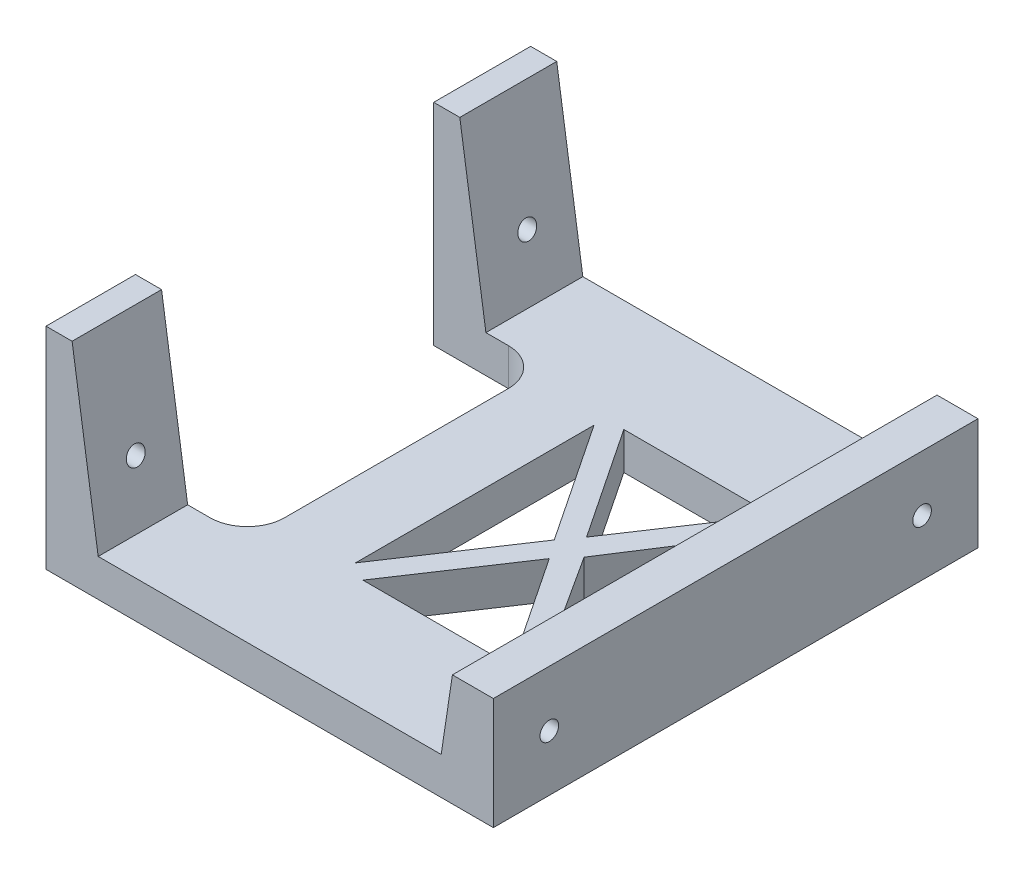
ISO-10303-21;
HEADER;
FILE_DESCRIPTION(('STEP AP214'),'2;1');
FILE_NAME('part.step','',(''),(''),'','','');
FILE_SCHEMA(('AUTOMOTIVE_DESIGN { 1 0 10303 214 1 1 1 1 }'));
ENDSEC;
DATA;
#1=APPLICATION_CONTEXT('core data for automotive mechanical design processes');
#2=APPLICATION_PROTOCOL_DEFINITION('international standard','automotive_design',2000,#1);
#3=PRODUCT_CONTEXT('',#1,'mechanical');
#4=PRODUCT('Part','Part','',(#3));
#5=PRODUCT_RELATED_PRODUCT_CATEGORY('part','',(#4));
#6=PRODUCT_DEFINITION_FORMATION('','',#4);
#7=PRODUCT_DEFINITION_CONTEXT('part definition',#1,'design');
#8=PRODUCT_DEFINITION('design','',#6,#7);
#9=PRODUCT_DEFINITION_SHAPE('','',#8);
#10=(LENGTH_UNIT() NAMED_UNIT(*) SI_UNIT(.MILLI.,.METRE.));
#11=(NAMED_UNIT(*) PLANE_ANGLE_UNIT() SI_UNIT($,.RADIAN.));
#12=(NAMED_UNIT(*) SI_UNIT($,.STERADIAN.) SOLID_ANGLE_UNIT());
#13=UNCERTAINTY_MEASURE_WITH_UNIT(LENGTH_MEASURE(1.E-05),#10,'distance_accuracy_value','');
#14=(GEOMETRIC_REPRESENTATION_CONTEXT(3) GLOBAL_UNCERTAINTY_ASSIGNED_CONTEXT((#13)) GLOBAL_UNIT_ASSIGNED_CONTEXT((#10,
#11,#12)) REPRESENTATION_CONTEXT('',''));
#15=CARTESIAN_POINT('',(0.,0.,0.));
#16=DIRECTION('',(0.,0.,1.));
#17=DIRECTION('',(1.,0.,0.));
#18=AXIS2_PLACEMENT_3D('',#15,#16,#17);
#19=CARTESIAN_POINT('',(-20.9345161290323,35.8775,82.55));
#20=DIRECTION('',(1.,0.,0.));
#21=DIRECTION('',(0.,1.,0.));
#22=AXIS2_PLACEMENT_3D('',#19,#20,#21);
#23=PLANE('',#22);
#24=CARTESIAN_POINT('',(-20.9345161290323,16.51,74.6125));
#25=DIRECTION('',(-1.,0.,0.));
#26=DIRECTION('',(0.,-1.,0.));
#27=AXIS2_PLACEMENT_3D('',#24,#25,#26);
#28=CIRCLE('',#27,1.5875);
#29=CARTESIAN_POINT('',(-20.9345161290323,14.9225,74.6125));
#30=VERTEX_POINT('',#29);
#31=EDGE_CURVE('E540',#30,#30,#28,.T.);
#32=ORIENTED_EDGE('',*,*,#31,.F.);
#33=EDGE_LOOP('',(#32));
#34=FACE_BOUND('',#33,.T.);
#35=DIRECTION('',(0.,0.,-1.));
#36=VECTOR('',#35,1.);
#37=CARTESIAN_POINT('',(-20.9345161290323,35.8775,82.55));
#38=LINE('',#37,#36);
#39=CARTESIAN_POINT('',(-20.9345161290323,35.8775,82.55));
#40=VERTEX_POINT('',#39);
#41=CARTESIAN_POINT('',(-20.9345161290323,35.8775,67.31));
#42=VERTEX_POINT('',#41);
#43=EDGE_CURVE('E418',#40,#42,#38,.T.);
#44=ORIENTED_EDGE('',*,*,#43,.T.);
#45=DIRECTION('',(0.,1.,0.));
#46=VECTOR('',#45,1.);
#47=CARTESIAN_POINT('',(-20.9345161290323,-14.9225,67.31));
#48=LINE('',#47,#46);
#49=CARTESIAN_POINT('',(-20.9345161290323,0.,67.31));
#50=VERTEX_POINT('',#49);
#51=EDGE_CURVE('E336',#50,#42,#48,.T.);
#52=ORIENTED_EDGE('',*,*,#51,.F.);
#53=DIRECTION('',(0.,0.,-1.));
#54=VECTOR('',#53,1.);
#55=CARTESIAN_POINT('',(-20.9345161290323,0.,82.55));
#56=LINE('',#55,#54);
#57=CARTESIAN_POINT('',(-20.9345161290323,0.,82.55));
#58=VERTEX_POINT('',#57);
#59=EDGE_CURVE('E441',#58,#50,#56,.T.);
#60=ORIENTED_EDGE('',*,*,#59,.F.);
#61=DIRECTION('',(0.,-1.,0.));
#62=VECTOR('',#61,1.);
#63=CARTESIAN_POINT('',(-20.9345161290323,35.8775,82.55));
#64=LINE('',#63,#62);
#65=EDGE_CURVE('E369',#40,#58,#64,.T.);
#66=ORIENTED_EDGE('',*,*,#65,.F.);
#67=EDGE_LOOP('',(#44,#52,#60,#66));
#68=FACE_BOUND('',#67,.T.);
#69=ADVANCED_FACE('F38',(#34,#68),#23,.F.);
#70=CARTESIAN_POINT('',(-12.0445161290323,6.34999999999999,82.55));
#71=DIRECTION('',(-0.988858224369282,-0.148860377862043,0.));
#72=DIRECTION('',(0.148860377862043,-0.988858224369282,0.));
#73=AXIS2_PLACEMENT_3D('',#70,#71,#72);
#74=PLANE('',#73);
#75=CARTESIAN_POINT('',(-13.5739784946237,16.51,74.6125));
#76=DIRECTION('',(-0.988858224369282,-0.148860377862043,0.));
#77=DIRECTION('',(-0.148860377862043,0.988858224369282,0.));
#78=AXIS2_PLACEMENT_3D('',#75,#76,#77);
#79=ELLIPSE('',#78,1.60538686019681,1.5875);
#80=CARTESIAN_POINT('',(-13.8129569892473,18.0975,74.6125));
#81=VERTEX_POINT('',#80);
#82=EDGE_CURVE('E527',#81,#81,#79,.T.);
#83=ORIENTED_EDGE('',*,*,#82,.T.);
#84=EDGE_LOOP('',(#83));
#85=FACE_BOUND('',#84,.T.);
#86=DIRECTION('',(0.,0.,-1.));
#87=VECTOR('',#86,1.);
#88=CARTESIAN_POINT('',(-12.0445161290323,6.34999999999999,82.55));
#89=LINE('',#88,#87);
#90=CARTESIAN_POINT('',(-12.0445161290323,6.34999999999999,82.55));
#91=VERTEX_POINT('',#90);
#92=CARTESIAN_POINT('',(-12.0445161290323,6.34999999999999,67.31));
#93=VERTEX_POINT('',#92);
#94=EDGE_CURVE('E428',#91,#93,#89,.T.);
#95=ORIENTED_EDGE('',*,*,#94,.T.);
#96=DIRECTION('',(-0.148860377862043,0.988858224369282,0.));
#97=VECTOR('',#96,1.);
#98=CARTESIAN_POINT('',(-12.0445161290323,6.34999999999999,67.31));
#99=LINE('',#98,#97);
#100=CARTESIAN_POINT('',(-16.4895161290323,35.8775,67.31));
#101=VERTEX_POINT('',#100);
#102=EDGE_CURVE('E353',#93,#101,#99,.T.);
#103=ORIENTED_EDGE('',*,*,#102,.T.);
#104=DIRECTION('',(0.,0.,-1.));
#105=VECTOR('',#104,1.);
#106=CARTESIAN_POINT('',(-16.4895161290323,35.8775,82.55));
#107=LINE('',#106,#105);
#108=CARTESIAN_POINT('',(-16.4895161290323,35.8775,82.55));
#109=VERTEX_POINT('',#108);
#110=EDGE_CURVE('E423',#109,#101,#107,.T.);
#111=ORIENTED_EDGE('',*,*,#110,.F.);
#112=DIRECTION('',(-0.148860377862043,0.988858224369282,0.));
#113=VECTOR('',#112,1.);
#114=CARTESIAN_POINT('',(-12.0445161290323,6.34999999999999,82.55));
#115=LINE('',#114,#113);
#116=EDGE_CURVE('E387',#91,#109,#115,.T.);
#117=ORIENTED_EDGE('',*,*,#116,.F.);
#118=EDGE_LOOP('',(#95,#103,#111,#117));
#119=FACE_BOUND('',#118,.T.);
#120=ADVANCED_FACE('F620',(#85,#119),#74,.F.);
#121=CARTESIAN_POINT('',(-16.4895161290323,35.8775,82.55));
#122=DIRECTION('',(0.,-1.,0.));
#123=DIRECTION('',(1.,0.,0.));
#124=AXIS2_PLACEMENT_3D('',#121,#122,#123);
#125=PLANE('',#124);
#126=ORIENTED_EDGE('',*,*,#110,.T.);
#127=DIRECTION('',(1.,0.,0.));
#128=VECTOR('',#127,1.);
#129=CARTESIAN_POINT('',(-1.88451612903228,35.8775,67.31));
#130=LINE('',#129,#128);
#131=EDGE_CURVE('E332',#42,#101,#130,.T.);
#132=ORIENTED_EDGE('',*,*,#131,.F.);
#133=ORIENTED_EDGE('',*,*,#43,.F.);
#134=DIRECTION('',(-1.,0.,0.));
#135=VECTOR('',#134,1.);
#136=CARTESIAN_POINT('',(-16.4895161290323,35.8775,82.55));
#137=LINE('',#136,#135);
#138=EDGE_CURVE('E390',#109,#40,#137,.T.);
#139=ORIENTED_EDGE('',*,*,#138,.F.);
#140=EDGE_LOOP('',(#126,#132,#133,#139));
#141=FACE_BOUND('',#140,.T.);
#142=ADVANCED_FACE('F615',(#141),#125,.F.);
#143=CARTESIAN_POINT('',(-20.9345161290323,16.51,7.9375));
#144=DIRECTION('',(-1.,0.,0.));
#145=DIRECTION('',(0.,-1.,0.));
#146=AXIS2_PLACEMENT_3D('',#143,#144,#145);
#147=CIRCLE('',#146,1.5875);
#148=CARTESIAN_POINT('',(-20.9345161290323,14.9225,7.9375));
#149=VERTEX_POINT('',#148);
#150=EDGE_CURVE('E528',#149,#149,#147,.T.);
#151=ORIENTED_EDGE('',*,*,#150,.F.);
#152=EDGE_LOOP('',(#151));
#153=FACE_BOUND('',#152,.T.);
#154=CARTESIAN_POINT('',(-20.9345161290323,0.,16.51));
#155=VERTEX_POINT('',#154);
#156=CARTESIAN_POINT('',(-20.9345161290323,0.,0.));
#157=VERTEX_POINT('',#156);
#158=EDGE_CURVE('E440',#155,#157,#56,.T.);
#159=ORIENTED_EDGE('',*,*,#158,.F.);
#160=DIRECTION('',(0.,1.,0.));
#161=VECTOR('',#160,1.);
#162=CARTESIAN_POINT('',(-20.9345161290323,-14.9225,16.51));
#163=LINE('',#162,#161);
#164=CARTESIAN_POINT('',(-20.9345161290323,35.8775,16.51));
#165=VERTEX_POINT('',#164);
#166=EDGE_CURVE('E335',#155,#165,#163,.T.);
#167=ORIENTED_EDGE('',*,*,#166,.T.);
#168=CARTESIAN_POINT('',(-20.9345161290323,35.8775,0.));
#169=VERTEX_POINT('',#168);
#170=EDGE_CURVE('E393',#165,#169,#38,.T.);
#171=ORIENTED_EDGE('',*,*,#170,.T.);
#172=DIRECTION('',(0.,-1.,0.));
#173=VECTOR('',#172,1.);
#174=CARTESIAN_POINT('',(-20.9345161290323,35.8775,0.));
#175=LINE('',#174,#173);
#176=EDGE_CURVE('E368',#169,#157,#175,.T.);
#177=ORIENTED_EDGE('',*,*,#176,.T.);
#178=EDGE_LOOP('',(#159,#167,#171,#177));
#179=FACE_BOUND('',#178,.T.);
#180=ADVANCED_FACE('F585',(#153,#179),#23,.F.);
#181=CARTESIAN_POINT('',(-20.9345161290323,0.,82.55));
#182=DIRECTION('',(0.,1.,0.));
#183=DIRECTION('',(0.,0.,1.));
#184=AXIS2_PLACEMENT_3D('',#181,#182,#183);
#185=PLANE('',#184);
#186=DIRECTION('',(0.554700196225229,0.,0.832050294337844));
#187=VECTOR('',#186,1.);
#188=CARTESIAN_POINT('',(24.3621505376344,0.,41.275));
#189=LINE('',#188,#187);
#190=CARTESIAN_POINT('',(10.8154838709677,0.,20.955));
#191=VERTEX_POINT('',#190);
#192=CARTESIAN_POINT('',(24.3621505376344,0.,41.275));
#193=VERTEX_POINT('',#192);
#194=EDGE_CURVE('E264',#191,#193,#189,.T.);
#195=ORIENTED_EDGE('',*,*,#194,.F.);
#196=DIRECTION('',(0.,0.,-1.));
#197=VECTOR('',#196,1.);
#198=CARTESIAN_POINT('',(10.8154838709677,0.,20.955));
#199=LINE('',#198,#197);
#200=CARTESIAN_POINT('',(10.8154838709677,0.,61.595));
#201=VERTEX_POINT('',#200);
#202=EDGE_CURVE('E56',#201,#191,#199,.T.);
#203=ORIENTED_EDGE('',*,*,#202,.F.);
#204=DIRECTION('',(-0.554700196225229,0.,0.832050294337844));
#205=VECTOR('',#204,1.);
#206=CARTESIAN_POINT('',(10.8154838709677,0.,61.595));
#207=LINE('',#206,#205);
#208=EDGE_CURVE('E269',#193,#201,#207,.T.);
#209=ORIENTED_EDGE('',*,*,#208,.F.);
#210=EDGE_LOOP('',(#195,#203,#209));
#211=FACE_BOUND('',#210,.T.);
#212=DIRECTION('',(0.542525431475665,0.,-0.840039377768771));
#213=VECTOR('',#212,1.);
#214=CARTESIAN_POINT('',(42.5654838709677,0.,20.955));
#215=LINE('',#214,#213);
#216=CARTESIAN_POINT('',(29.4421505376344,0.,41.275));
#217=VERTEX_POINT('',#216);
#218=CARTESIAN_POINT('',(42.5654838709677,0.,20.955));
#219=VERTEX_POINT('',#218);
#220=EDGE_CURVE('E285',#217,#219,#215,.T.);
#221=ORIENTED_EDGE('',*,*,#220,.F.);
#222=DIRECTION('',(-0.542525431475665,0.,-0.840039377768771));
#223=VECTOR('',#222,1.);
#224=CARTESIAN_POINT('',(29.4421505376344,0.,41.275));
#225=LINE('',#224,#223);
#226=CARTESIAN_POINT('',(42.5654838709677,0.,61.595));
#227=VERTEX_POINT('',#226);
#228=EDGE_CURVE('E64',#227,#217,#225,.T.);
#229=ORIENTED_EDGE('',*,*,#228,.F.);
#230=DIRECTION('',(0.,0.,1.));
#231=VECTOR('',#230,1.);
#232=CARTESIAN_POINT('',(42.5654838709677,0.,61.595));
#233=LINE('',#232,#231);
#234=EDGE_CURVE('E289',#219,#227,#233,.T.);
#235=ORIENTED_EDGE('',*,*,#234,.F.);
#236=EDGE_LOOP('',(#221,#229,#235));
#237=FACE_BOUND('',#236,.T.);
#238=DIRECTION('',(-0.554700196225229,0.,-0.832050294337844));
#239=VECTOR('',#238,1.);
#240=CARTESIAN_POINT('',(13.9904838709677,0.,19.05));
#241=LINE('',#240,#239);
#242=CARTESIAN_POINT('',(26.6904838709677,0.,38.1));
#243=VERTEX_POINT('',#242);
#244=CARTESIAN_POINT('',(13.9904838709677,0.,19.05));
#245=VERTEX_POINT('',#244);
#246=EDGE_CURVE('E245',#243,#245,#241,.T.);
#247=ORIENTED_EDGE('',*,*,#246,.F.);
#248=DIRECTION('',(-0.554700196225229,0.,0.832050294337844));
#249=VECTOR('',#248,1.);
#250=CARTESIAN_POINT('',(26.6904838709677,0.,38.1));
#251=LINE('',#250,#249);
#252=CARTESIAN_POINT('',(39.3904838709677,0.,19.05));
#253=VERTEX_POINT('',#252);
#254=EDGE_CURVE('E250',#253,#243,#251,.T.);
#255=ORIENTED_EDGE('',*,*,#254,.F.);
#256=DIRECTION('',(1.,0.,0.));
#257=VECTOR('',#256,1.);
#258=CARTESIAN_POINT('',(39.3904838709677,0.,19.05));
#259=LINE('',#258,#257);
#260=EDGE_CURVE('E233',#245,#253,#259,.T.);
#261=ORIENTED_EDGE('',*,*,#260,.F.);
#262=EDGE_LOOP('',(#247,#255,#261));
#263=FACE_BOUND('',#262,.T.);
#264=DIRECTION('',(0.554700196225229,0.,0.832050294337844));
#265=VECTOR('',#264,1.);
#266=CARTESIAN_POINT('',(39.3904838709677,0.,63.5));
#267=LINE('',#266,#265);
#268=CARTESIAN_POINT('',(26.6904838709677,0.,44.45));
#269=VERTEX_POINT('',#268);
#270=CARTESIAN_POINT('',(39.3904838709677,0.,63.5));
#271=VERTEX_POINT('',#270);
#272=EDGE_CURVE('E303',#269,#271,#267,.T.);
#273=ORIENTED_EDGE('',*,*,#272,.F.);
#274=DIRECTION('',(0.554700196225229,0.,-0.832050294337844));
#275=VECTOR('',#274,1.);
#276=CARTESIAN_POINT('',(26.6904838709677,0.,44.45));
#277=LINE('',#276,#275);
#278=CARTESIAN_POINT('',(13.9904838709677,0.,63.5));
#279=VERTEX_POINT('',#278);
#280=EDGE_CURVE('E277',#279,#269,#277,.T.);
#281=ORIENTED_EDGE('',*,*,#280,.F.);
#282=DIRECTION('',(-1.,0.,0.));
#283=VECTOR('',#282,1.);
#284=CARTESIAN_POINT('',(13.9904838709677,0.,63.5));
#285=LINE('',#284,#283);
#286=EDGE_CURVE('E307',#271,#279,#285,.T.);
#287=ORIENTED_EDGE('',*,*,#286,.F.);
#288=EDGE_LOOP('',(#273,#281,#287));
#289=FACE_BOUND('',#288,.T.);
#290=ORIENTED_EDGE('',*,*,#59,.T.);
#291=DIRECTION('',(1.,0.,0.));
#292=VECTOR('',#291,1.);
#293=CARTESIAN_POINT('',(-20.9345161290323,0.,67.31));
#294=LINE('',#293,#292);
#295=CARTESIAN_POINT('',(-8.23451612903228,0.,67.31));
#296=VERTEX_POINT('',#295);
#297=EDGE_CURVE('E360',#50,#296,#294,.T.);
#298=ORIENTED_EDGE('',*,*,#297,.T.);
#299=CARTESIAN_POINT('',(-8.23451612903228,0.,60.96));
#300=DIRECTION('',(0.,1.,0.));
#301=DIRECTION('',(0.,0.,1.));
#302=AXIS2_PLACEMENT_3D('',#299,#300,#301);
#303=CIRCLE('',#302,6.35);
#304=CARTESIAN_POINT('',(-1.88451612903228,0.,60.96));
#305=VERTEX_POINT('',#304);
#306=EDGE_CURVE('E476',#296,#305,#303,.T.);
#307=ORIENTED_EDGE('',*,*,#306,.T.);
#308=DIRECTION('',(0.,0.,-1.));
#309=VECTOR('',#308,1.);
#310=CARTESIAN_POINT('',(-1.88451612903228,0.,82.55));
#311=LINE('',#310,#309);
#312=CARTESIAN_POINT('',(-1.88451612903228,0.,22.86));
#313=VERTEX_POINT('',#312);
#314=EDGE_CURVE('E364',#305,#313,#311,.T.);
#315=ORIENTED_EDGE('',*,*,#314,.T.);
#316=CARTESIAN_POINT('',(-8.23451612903228,0.,22.86));
#317=DIRECTION('',(0.,1.,0.));
#318=DIRECTION('',(0.,0.,1.));
#319=AXIS2_PLACEMENT_3D('',#316,#317,#318);
#320=CIRCLE('',#319,6.35);
#321=CARTESIAN_POINT('',(-8.23451612903228,0.,16.51));
#322=VERTEX_POINT('',#321);
#323=EDGE_CURVE('E470',#313,#322,#320,.T.);
#324=ORIENTED_EDGE('',*,*,#323,.T.);
#325=DIRECTION('',(-1.,0.,0.));
#326=VECTOR('',#325,1.);
#327=CARTESIAN_POINT('',(-20.9345161290323,0.,16.51));
#328=LINE('',#327,#326);
#329=EDGE_CURVE('E350',#322,#155,#328,.T.);
#330=ORIENTED_EDGE('',*,*,#329,.T.);
#331=ORIENTED_EDGE('',*,*,#158,.T.);
#332=DIRECTION('',(1.,0.,0.));
#333=VECTOR('',#332,1.);
#334=CARTESIAN_POINT('',(-20.9345161290323,0.,0.));
#335=LINE('',#334,#333);
#336=CARTESIAN_POINT('',(55.2654838709677,0.,0.));
#337=VERTEX_POINT('',#336);
#338=EDGE_CURVE('E397',#157,#337,#335,.T.);
#339=ORIENTED_EDGE('',*,*,#338,.T.);
#340=DIRECTION('',(0.,0.,-1.));
#341=VECTOR('',#340,1.);
#342=CARTESIAN_POINT('',(55.2654838709677,0.,82.55));
#343=LINE('',#342,#341);
#344=CARTESIAN_POINT('',(55.2654838709677,0.,82.55));
#345=VERTEX_POINT('',#344);
#346=EDGE_CURVE('E436',#345,#337,#343,.T.);
#347=ORIENTED_EDGE('',*,*,#346,.F.);
#348=DIRECTION('',(1.,0.,0.));
#349=VECTOR('',#348,1.);
#350=CARTESIAN_POINT('',(-20.9345161290323,0.,82.55));
#351=LINE('',#350,#349);
#352=EDGE_CURVE('E373',#58,#345,#351,.T.);
#353=ORIENTED_EDGE('',*,*,#352,.F.);
#354=EDGE_LOOP('',(#290,#298,#307,#315,#324,#330,#331,#339,#347,#353));
#355=FACE_BOUND('',#354,.T.);
#356=ADVANCED_FACE('F252',(#211,#237,#263,#289,#355),#185,.F.);
#357=CARTESIAN_POINT('',(55.2654838709677,0.,82.55));
#358=DIRECTION('',(-1.,0.,0.));
#359=DIRECTION('',(0.,0.,1.));
#360=AXIS2_PLACEMENT_3D('',#357,#358,#359);
#361=PLANE('',#360);
#362=CARTESIAN_POINT('',(55.2654838709677,9.525,9.525));
#363=DIRECTION('',(1.,0.,0.));
#364=DIRECTION('',(0.,0.,-1.));
#365=AXIS2_PLACEMENT_3D('',#362,#363,#364);
#366=CIRCLE('',#365,1.5875);
#367=CARTESIAN_POINT('',(55.2654838709677,9.525,7.9375));
#368=VERTEX_POINT('',#367);
#369=EDGE_CURVE('E534',#368,#368,#366,.T.);
#370=ORIENTED_EDGE('',*,*,#369,.F.);
#371=EDGE_LOOP('',(#370));
#372=FACE_BOUND('',#371,.T.);
#373=CARTESIAN_POINT('',(55.2654838709677,9.525,73.0249999999995));
#374=DIRECTION('',(1.,0.,0.));
#375=DIRECTION('',(0.,0.,-1.));
#376=AXIS2_PLACEMENT_3D('',#373,#374,#375);
#377=CIRCLE('',#376,1.5875);
#378=CARTESIAN_POINT('',(55.2654838709677,9.525,71.4374999999994));
#379=VERTEX_POINT('',#378);
#380=EDGE_CURVE('E542',#379,#379,#377,.T.);
#381=ORIENTED_EDGE('',*,*,#380,.F.);
#382=EDGE_LOOP('',(#381));
#383=FACE_BOUND('',#382,.T.);
#384=DIRECTION('',(0.,1.,0.));
#385=VECTOR('',#384,1.);
#386=CARTESIAN_POINT('',(55.2654838709677,0.,0.));
#387=LINE('',#386,#385);
#388=CARTESIAN_POINT('',(55.2654838709677,19.05,0.));
#389=VERTEX_POINT('',#388);
#390=EDGE_CURVE('E400',#337,#389,#387,.T.);
#391=ORIENTED_EDGE('',*,*,#390,.T.);
#392=DIRECTION('',(0.,0.,1.));
#393=VECTOR('',#392,1.);
#394=CARTESIAN_POINT('',(55.2654838709677,19.05,82.55));
#395=LINE('',#394,#393);
#396=CARTESIAN_POINT('',(55.2654838709677,19.05,82.55));
#397=VERTEX_POINT('',#396);
#398=EDGE_CURVE('E328',#389,#397,#395,.T.);
#399=ORIENTED_EDGE('',*,*,#398,.T.);
#400=DIRECTION('',(0.,1.,0.));
#401=VECTOR('',#400,1.);
#402=CARTESIAN_POINT('',(55.2654838709677,0.,82.55));
#403=LINE('',#402,#401);
#404=EDGE_CURVE('E377',#345,#397,#403,.T.);
#405=ORIENTED_EDGE('',*,*,#404,.F.);
#406=ORIENTED_EDGE('',*,*,#346,.T.);
#407=EDGE_LOOP('',(#391,#399,#405,#406));
#408=FACE_BOUND('',#407,.T.);
#409=ADVANCED_FACE('F598',(#372,#383,#408),#361,.F.);
#410=CARTESIAN_POINT('',(50.8204838709677,35.8775,82.55));
#411=DIRECTION('',(0.988858224369282,-0.148860377862042,0.));
#412=DIRECTION('',(0.148860377862042,0.988858224369282,0.));
#413=AXIS2_PLACEMENT_3D('',#410,#411,#412);
#414=PLANE('',#413);
#415=CARTESIAN_POINT('',(46.853440860215,9.525,9.525));
#416=DIRECTION('',(0.988858224369282,-0.148860377862042,0.));
#417=DIRECTION('',(0.148860377862042,0.988858224369282,0.));
#418=AXIS2_PLACEMENT_3D('',#415,#416,#417);
#419=ELLIPSE('',#418,1.60538686019682,1.5875);
#420=CARTESIAN_POINT('',(47.0924193548387,11.1125,9.525));
#421=VERTEX_POINT('',#420);
#422=EDGE_CURVE('E42',#421,#421,#419,.T.);
#423=ORIENTED_EDGE('',*,*,#422,.T.);
#424=EDGE_LOOP('',(#423));
#425=FACE_BOUND('',#424,.T.);
#426=CARTESIAN_POINT('',(46.853440860215,9.525,73.0249999999995));
#427=DIRECTION('',(0.988858224369282,-0.148860377862042,0.));
#428=DIRECTION('',(0.148860377862042,0.988858224369282,0.));
#429=AXIS2_PLACEMENT_3D('',#426,#427,#428);
#430=ELLIPSE('',#429,1.60538686019681,1.5875);
#431=CARTESIAN_POINT('',(47.0924193548387,11.1125,73.0249999999995));
#432=VERTEX_POINT('',#431);
#433=EDGE_CURVE('E531',#432,#432,#430,.T.);
#434=ORIENTED_EDGE('',*,*,#433,.T.);
#435=EDGE_LOOP('',(#434));
#436=FACE_BOUND('',#435,.T.);
#437=DIRECTION('',(-0.148860377862042,-0.988858224369282,0.));
#438=VECTOR('',#437,1.);
#439=CARTESIAN_POINT('',(50.8204838709677,35.8775,82.55));
#440=LINE('',#439,#438);
#441=CARTESIAN_POINT('',(48.287311827957,19.05,82.55));
#442=VERTEX_POINT('',#441);
#443=CARTESIAN_POINT('',(46.3754838709677,6.35,82.55));
#444=VERTEX_POINT('',#443);
#445=EDGE_CURVE('E381',#442,#444,#440,.T.);
#446=ORIENTED_EDGE('',*,*,#445,.F.);
#447=DIRECTION('',(0.,0.,-1.));
#448=VECTOR('',#447,1.);
#449=CARTESIAN_POINT('',(48.287311827957,19.05,82.55));
#450=LINE('',#449,#448);
#451=CARTESIAN_POINT('',(48.287311827957,19.05,0.));
#452=VERTEX_POINT('',#451);
#453=EDGE_CURVE('E324',#442,#452,#450,.T.);
#454=ORIENTED_EDGE('',*,*,#453,.T.);
#455=DIRECTION('',(-0.148860377862042,-0.988858224369282,0.));
#456=VECTOR('',#455,1.);
#457=CARTESIAN_POINT('',(50.8204838709677,35.8775,0.));
#458=LINE('',#457,#456);
#459=CARTESIAN_POINT('',(46.3754838709677,6.35,0.));
#460=VERTEX_POINT('',#459);
#461=EDGE_CURVE('E404',#452,#460,#458,.T.);
#462=ORIENTED_EDGE('',*,*,#461,.T.);
#463=DIRECTION('',(0.,0.,-1.));
#464=VECTOR('',#463,1.);
#465=CARTESIAN_POINT('',(46.3754838709677,6.35,82.55));
#466=LINE('',#465,#464);
#467=EDGE_CURVE('E432',#444,#460,#466,.T.);
#468=ORIENTED_EDGE('',*,*,#467,.F.);
#469=EDGE_LOOP('',(#446,#454,#462,#468));
#470=FACE_BOUND('',#469,.T.);
#471=ADVANCED_FACE('F563',(#425,#436,#470),#414,.F.);
#472=CARTESIAN_POINT('',(46.3754838709677,6.35,82.55));
#473=DIRECTION('',(0.,-1.,0.));
#474=DIRECTION('',(1.,0.,0.));
#475=AXIS2_PLACEMENT_3D('',#472,#473,#474);
#476=PLANE('',#475);
#477=DIRECTION('',(-0.554700196225229,0.,0.832050294337844));
#478=VECTOR('',#477,1.);
#479=CARTESIAN_POINT('',(12.0854838709677,6.35,59.69));
#480=LINE('',#479,#478);
#481=CARTESIAN_POINT('',(24.3621505376344,6.35,41.275));
#482=VERTEX_POINT('',#481);
#483=CARTESIAN_POINT('',(10.8154838709677,6.34999999999999,61.595));
#484=VERTEX_POINT('',#483);
#485=EDGE_CURVE('E48',#482,#484,#480,.T.);
#486=ORIENTED_EDGE('',*,*,#485,.T.);
#487=DIRECTION('',(0.,0.,-1.));
#488=VECTOR('',#487,1.);
#489=CARTESIAN_POINT('',(10.8154838709677,6.35,82.55));
#490=LINE('',#489,#488);
#491=CARTESIAN_POINT('',(10.8154838709677,6.34999999999999,20.955));
#492=VERTEX_POINT('',#491);
#493=EDGE_CURVE('E11',#484,#492,#490,.T.);
#494=ORIENTED_EDGE('',*,*,#493,.T.);
#495=DIRECTION('',(0.554700196225229,0.,0.832050294337844));
#496=VECTOR('',#495,1.);
#497=CARTESIAN_POINT('',(50.1854838709677,6.35,80.01));
#498=LINE('',#497,#496);
#499=EDGE_CURVE('E516',#492,#482,#498,.T.);
#500=ORIENTED_EDGE('',*,*,#499,.T.);
#501=EDGE_LOOP('',(#486,#494,#500));
#502=FACE_BOUND('',#501,.T.);
#503=DIRECTION('',(0.,0.,1.));
#504=VECTOR('',#503,1.);
#505=CARTESIAN_POINT('',(42.5654838709677,6.35,82.55));
#506=LINE('',#505,#504);
#507=CARTESIAN_POINT('',(42.5654838709677,6.35,20.955));
#508=VERTEX_POINT('',#507);
#509=CARTESIAN_POINT('',(42.5654838709677,6.35,61.595));
#510=VERTEX_POINT('',#509);
#511=EDGE_CURVE('E508',#508,#510,#506,.T.);
#512=ORIENTED_EDGE('',*,*,#511,.T.);
#513=DIRECTION('',(-0.542525431475665,0.,-0.840039377768771));
#514=VECTOR('',#513,1.);
#515=CARTESIAN_POINT('',(53.2369846366645,6.35,78.1186140888208));
#516=LINE('',#515,#514);
#517=CARTESIAN_POINT('',(29.4421505376344,6.35,41.275));
#518=VERTEX_POINT('',#517);
#519=EDGE_CURVE('E512',#510,#518,#516,.T.);
#520=ORIENTED_EDGE('',*,*,#519,.T.);
#521=DIRECTION('',(0.542525431475665,0.,-0.840039377768771));
#522=VECTOR('',#521,1.);
#523=CARTESIAN_POINT('',(15.615422615225,6.35,62.6841271056661));
#524=LINE('',#523,#522);
#525=EDGE_CURVE('E504',#518,#508,#524,.T.);
#526=ORIENTED_EDGE('',*,*,#525,.T.);
#527=EDGE_LOOP('',(#512,#520,#526));
#528=FACE_BOUND('',#527,.T.);
#529=DIRECTION('',(1.,0.,0.));
#530=VECTOR('',#529,1.);
#531=CARTESIAN_POINT('',(46.3754838709677,6.35,19.05));
#532=LINE('',#531,#530);
#533=CARTESIAN_POINT('',(13.9904838709677,6.35,19.05));
#534=VERTEX_POINT('',#533);
#535=CARTESIAN_POINT('',(39.3904838709677,6.34999999999999,19.05));
#536=VERTEX_POINT('',#535);
#537=EDGE_CURVE('E236',#534,#536,#532,.T.);
#538=ORIENTED_EDGE('',*,*,#537,.T.);
#539=DIRECTION('',(-0.554700196225229,0.,0.832050294337844));
#540=VECTOR('',#539,1.);
#541=CARTESIAN_POINT('',(12.2320223325062,6.35,59.7876923076923));
#542=LINE('',#541,#540);
#543=CARTESIAN_POINT('',(26.6904838709677,6.34999999999999,38.1));
#544=VERTEX_POINT('',#543);
#545=EDGE_CURVE('E500',#536,#544,#542,.T.);
#546=ORIENTED_EDGE('',*,*,#545,.T.);
#547=DIRECTION('',(-0.554700196225229,0.,-0.832050294337844));
#548=VECTOR('',#547,1.);
#549=CARTESIAN_POINT('',(53.2627915632754,6.35,77.9584615384615));
#550=LINE('',#549,#548);
#551=EDGE_CURVE('E495',#544,#534,#550,.T.);
#552=ORIENTED_EDGE('',*,*,#551,.T.);
#553=EDGE_LOOP('',(#538,#546,#552));
#554=FACE_BOUND('',#553,.T.);
#555=DIRECTION('',(-1.,0.,0.));
#556=VECTOR('',#555,1.);
#557=CARTESIAN_POINT('',(46.3754838709677,6.35,63.5));
#558=LINE('',#557,#556);
#559=CARTESIAN_POINT('',(39.3904838709677,6.35,63.5));
#560=VERTEX_POINT('',#559);
#561=CARTESIAN_POINT('',(13.9904838709677,6.34999999999999,63.5));
#562=VERTEX_POINT('',#561);
#563=EDGE_CURVE('E487',#560,#562,#558,.T.);
#564=ORIENTED_EDGE('',*,*,#563,.T.);
#565=DIRECTION('',(0.554700196225229,0.,-0.832050294337844));
#566=VECTOR('',#565,1.);
#567=CARTESIAN_POINT('',(15.1627915632754,6.35,61.7415384615385));
#568=LINE('',#567,#566);
#569=CARTESIAN_POINT('',(26.6904838709677,6.34999999999999,44.45));
#570=VERTEX_POINT('',#569);
#571=EDGE_CURVE('E491',#562,#570,#568,.T.);
#572=ORIENTED_EDGE('',*,*,#571,.T.);
#573=DIRECTION('',(0.554700196225229,0.,0.832050294337844));
#574=VECTOR('',#573,1.);
#575=CARTESIAN_POINT('',(50.3320223325062,6.35,79.9123076923077));
#576=LINE('',#575,#574);
#577=EDGE_CURVE('E483',#570,#560,#576,.T.);
#578=ORIENTED_EDGE('',*,*,#577,.T.);
#579=EDGE_LOOP('',(#564,#572,#578));
#580=FACE_BOUND('',#579,.T.);
#581=DIRECTION('',(1.,0.,0.));
#582=VECTOR('',#581,1.);
#583=CARTESIAN_POINT('',(46.3754838709677,6.35,16.51));
#584=LINE('',#583,#582);
#585=CARTESIAN_POINT('',(-12.0445161290323,6.34999999999999,16.51));
#586=VERTEX_POINT('',#585);
#587=CARTESIAN_POINT('',(-8.23451612903228,6.34999999999999,16.51));
#588=VERTEX_POINT('',#587);
#589=EDGE_CURVE('E346',#586,#588,#584,.T.);
#590=ORIENTED_EDGE('',*,*,#589,.T.);
#591=CARTESIAN_POINT('',(-8.23451612903228,6.35,22.86));
#592=DIRECTION('',(0.,-1.,0.));
#593=DIRECTION('',(1.,0.,0.));
#594=AXIS2_PLACEMENT_3D('',#591,#592,#593);
#595=CIRCLE('',#594,6.35);
#596=CARTESIAN_POINT('',(-1.88451612903228,6.35,22.86));
#597=VERTEX_POINT('',#596);
#598=EDGE_CURVE('E467',#588,#597,#595,.T.);
#599=ORIENTED_EDGE('',*,*,#598,.T.);
#600=DIRECTION('',(0.,0.,1.));
#601=VECTOR('',#600,1.);
#602=CARTESIAN_POINT('',(-1.88451612903228,6.35,82.55));
#603=LINE('',#602,#601);
#604=CARTESIAN_POINT('',(-1.88451612903228,6.35,60.96));
#605=VERTEX_POINT('',#604);
#606=EDGE_CURVE('E449',#597,#605,#603,.T.);
#607=ORIENTED_EDGE('',*,*,#606,.T.);
#608=CARTESIAN_POINT('',(-8.23451612903228,6.35,60.96));
#609=DIRECTION('',(0.,-1.,0.));
#610=DIRECTION('',(1.,0.,0.));
#611=AXIS2_PLACEMENT_3D('',#608,#609,#610);
#612=CIRCLE('',#611,6.35);
#613=CARTESIAN_POINT('',(-8.23451612903228,6.34999999999999,67.31));
#614=VERTEX_POINT('',#613);
#615=EDGE_CURVE('E473',#605,#614,#612,.T.);
#616=ORIENTED_EDGE('',*,*,#615,.T.);
#617=DIRECTION('',(-1.,0.,0.));
#618=VECTOR('',#617,1.);
#619=CARTESIAN_POINT('',(46.3754838709677,6.35,67.31));
#620=LINE('',#619,#618);
#621=EDGE_CURVE('E357',#614,#93,#620,.T.);
#622=ORIENTED_EDGE('',*,*,#621,.T.);
#623=ORIENTED_EDGE('',*,*,#94,.F.);
#624=DIRECTION('',(-1.,0.,0.));
#625=VECTOR('',#624,1.);
#626=CARTESIAN_POINT('',(46.3754838709677,6.35,82.55));
#627=LINE('',#626,#625);
#628=EDGE_CURVE('E384',#444,#91,#627,.T.);
#629=ORIENTED_EDGE('',*,*,#628,.F.);
#630=ORIENTED_EDGE('',*,*,#467,.T.);
#631=DIRECTION('',(-1.,0.,0.));
#632=VECTOR('',#631,1.);
#633=CARTESIAN_POINT('',(46.3754838709677,6.35,0.));
#634=LINE('',#633,#632);
#635=CARTESIAN_POINT('',(-12.0445161290323,6.34999999999999,0.));
#636=VERTEX_POINT('',#635);
#637=EDGE_CURVE('E407',#460,#636,#634,.T.);
#638=ORIENTED_EDGE('',*,*,#637,.T.);
#639=EDGE_CURVE('E427',#586,#636,#89,.T.);
#640=ORIENTED_EDGE('',*,*,#639,.F.);
#641=EDGE_LOOP('',(#590,#599,#607,#616,#622,#623,#629,#630,#638,#640));
#642=FACE_BOUND('',#641,.T.);
#643=ADVANCED_FACE('F559',(#502,#528,#554,#580,#642),#476,.F.);
#644=CARTESIAN_POINT('',(-13.5739784946237,16.51,7.9375));
#645=DIRECTION('',(-0.988858224369282,-0.148860377862043,0.));
#646=DIRECTION('',(-0.148860377862043,0.988858224369282,0.));
#647=AXIS2_PLACEMENT_3D('',#644,#645,#646);
#648=ELLIPSE('',#647,1.60538686019682,1.5875);
#649=CARTESIAN_POINT('',(-13.8129569892473,18.0975,7.9375));
#650=VERTEX_POINT('',#649);
#651=EDGE_CURVE('E523',#650,#650,#648,.T.);
#652=ORIENTED_EDGE('',*,*,#651,.T.);
#653=EDGE_LOOP('',(#652));
#654=FACE_BOUND('',#653,.T.);
#655=CARTESIAN_POINT('',(-16.4895161290323,35.8775,16.51));
#656=VERTEX_POINT('',#655);
#657=CARTESIAN_POINT('',(-16.4895161290323,35.8775,0.));
#658=VERTEX_POINT('',#657);
#659=EDGE_CURVE('E422',#656,#658,#107,.T.);
#660=ORIENTED_EDGE('',*,*,#659,.F.);
#661=DIRECTION('',(0.148860377862043,-0.988858224369282,0.));
#662=VECTOR('',#661,1.);
#663=CARTESIAN_POINT('',(-12.0445161290323,6.34999999999999,16.51));
#664=LINE('',#663,#662);
#665=EDGE_CURVE('E339',#656,#586,#664,.T.);
#666=ORIENTED_EDGE('',*,*,#665,.T.);
#667=ORIENTED_EDGE('',*,*,#639,.T.);
#668=DIRECTION('',(-0.148860377862043,0.988858224369282,0.));
#669=VECTOR('',#668,1.);
#670=CARTESIAN_POINT('',(-12.0445161290323,6.34999999999999,0.));
#671=LINE('',#670,#669);
#672=EDGE_CURVE('E411',#636,#658,#671,.T.);
#673=ORIENTED_EDGE('',*,*,#672,.T.);
#674=EDGE_LOOP('',(#660,#666,#667,#673));
#675=FACE_BOUND('',#674,.T.);
#676=ADVANCED_FACE('F562',(#654,#675),#74,.F.);
#677=ORIENTED_EDGE('',*,*,#170,.F.);
#678=DIRECTION('',(1.,0.,0.));
#679=VECTOR('',#678,1.);
#680=CARTESIAN_POINT('',(-16.4895161290323,35.8775,16.51));
#681=LINE('',#680,#679);
#682=EDGE_CURVE('E445',#165,#656,#681,.T.);
#683=ORIENTED_EDGE('',*,*,#682,.T.);
#684=ORIENTED_EDGE('',*,*,#659,.T.);
#685=DIRECTION('',(-1.,0.,0.));
#686=VECTOR('',#685,1.);
#687=CARTESIAN_POINT('',(-16.4895161290323,35.8775,0.));
#688=LINE('',#687,#686);
#689=EDGE_CURVE('E374',#658,#169,#688,.T.);
#690=ORIENTED_EDGE('',*,*,#689,.T.);
#691=EDGE_LOOP('',(#677,#683,#684,#690));
#692=FACE_BOUND('',#691,.T.);
#693=ADVANCED_FACE('F588',(#692),#125,.F.);
#694=CARTESIAN_POINT('',(0.,0.,82.55));
#695=DIRECTION('',(0.,0.,1.));
#696=DIRECTION('',(1.,0.,0.));
#697=AXIS2_PLACEMENT_3D('',#694,#695,#696);
#698=PLANE('',#697);
#699=DIRECTION('',(1.,0.,0.));
#700=VECTOR('',#699,1.);
#701=CARTESIAN_POINT('',(42.6345230795335,19.05,82.55));
#702=LINE('',#701,#700);
#703=EDGE_CURVE('E315',#442,#397,#702,.T.);
#704=ORIENTED_EDGE('',*,*,#703,.F.);
#705=ORIENTED_EDGE('',*,*,#445,.T.);
#706=ORIENTED_EDGE('',*,*,#628,.T.);
#707=ORIENTED_EDGE('',*,*,#116,.T.);
#708=ORIENTED_EDGE('',*,*,#138,.T.);
#709=ORIENTED_EDGE('',*,*,#65,.T.);
#710=ORIENTED_EDGE('',*,*,#352,.T.);
#711=ORIENTED_EDGE('',*,*,#404,.T.);
#712=EDGE_LOOP('',(#704,#705,#706,#707,#708,#709,#710,#711));
#713=FACE_BOUND('',#712,.T.);
#714=ADVANCED_FACE('F601',(#713),#698,.T.);
#715=CARTESIAN_POINT('',(0.,0.,0.));
#716=DIRECTION('',(0.,0.,1.));
#717=DIRECTION('',(1.,0.,0.));
#718=AXIS2_PLACEMENT_3D('',#715,#716,#717);
#719=PLANE('',#718);
#720=ORIENTED_EDGE('',*,*,#461,.F.);
#721=DIRECTION('',(1.,0.,0.));
#722=VECTOR('',#721,1.);
#723=CARTESIAN_POINT('',(0.,19.05,0.));
#724=LINE('',#723,#722);
#725=EDGE_CURVE('E479',#452,#389,#724,.T.);
#726=ORIENTED_EDGE('',*,*,#725,.T.);
#727=ORIENTED_EDGE('',*,*,#390,.F.);
#728=ORIENTED_EDGE('',*,*,#338,.F.);
#729=ORIENTED_EDGE('',*,*,#176,.F.);
#730=ORIENTED_EDGE('',*,*,#689,.F.);
#731=ORIENTED_EDGE('',*,*,#672,.F.);
#732=ORIENTED_EDGE('',*,*,#637,.F.);
#733=EDGE_LOOP('',(#720,#726,#727,#728,#729,#730,#731,#732));
#734=FACE_BOUND('',#733,.T.);
#735=ADVANCED_FACE('F592',(#734),#719,.F.);
#736=CARTESIAN_POINT('',(-1.88451612903228,-14.9225,16.51));
#737=DIRECTION('',(1.,0.,0.));
#738=DIRECTION('',(0.,0.,-1.));
#739=AXIS2_PLACEMENT_3D('',#736,#737,#738);
#740=PLANE('',#739);
#741=ORIENTED_EDGE('',*,*,#606,.F.);
#742=DIRECTION('',(0.,1.,0.));
#743=VECTOR('',#742,1.);
#744=CARTESIAN_POINT('',(-1.88451612903228,0.,22.86));
#745=LINE('',#744,#743);
#746=EDGE_CURVE('E461',#597,#313,#745,.F.);
#747=ORIENTED_EDGE('',*,*,#746,.T.);
#748=ORIENTED_EDGE('',*,*,#314,.F.);
#749=DIRECTION('',(0.,1.,0.));
#750=VECTOR('',#749,1.);
#751=CARTESIAN_POINT('',(-1.88451612903228,6.34999999999999,60.96));
#752=LINE('',#751,#750);
#753=EDGE_CURVE('E457',#305,#605,#752,.T.);
#754=ORIENTED_EDGE('',*,*,#753,.T.);
#755=EDGE_LOOP('',(#741,#747,#748,#754));
#756=FACE_BOUND('',#755,.T.);
#757=ADVANCED_FACE('F628',(#756),#740,.F.);
#758=CARTESIAN_POINT('',(-1.88451612903228,-14.9225,67.31));
#759=DIRECTION('',(0.,0.,1.));
#760=DIRECTION('',(1.,0.,0.));
#761=AXIS2_PLACEMENT_3D('',#758,#759,#760);
#762=PLANE('',#761);
#763=ORIENTED_EDGE('',*,*,#621,.F.);
#764=DIRECTION('',(0.,1.,0.));
#765=VECTOR('',#764,1.);
#766=CARTESIAN_POINT('',(-8.23451612903228,0.,67.31));
#767=LINE('',#766,#765);
#768=EDGE_CURVE('E464',#614,#296,#767,.F.);
#769=ORIENTED_EDGE('',*,*,#768,.T.);
#770=ORIENTED_EDGE('',*,*,#297,.F.);
#771=ORIENTED_EDGE('',*,*,#51,.T.);
#772=ORIENTED_EDGE('',*,*,#131,.T.);
#773=ORIENTED_EDGE('',*,*,#102,.F.);
#774=EDGE_LOOP('',(#763,#769,#770,#771,#772,#773));
#775=FACE_BOUND('',#774,.T.);
#776=ADVANCED_FACE('F612',(#775),#762,.F.);
#777=CARTESIAN_POINT('',(-20.9345161290323,-14.9225,16.51));
#778=DIRECTION('',(0.,0.,-1.));
#779=DIRECTION('',(-1.,0.,0.));
#780=AXIS2_PLACEMENT_3D('',#777,#778,#779);
#781=PLANE('',#780);
#782=ORIENTED_EDGE('',*,*,#329,.F.);
#783=DIRECTION('',(0.,1.,0.));
#784=VECTOR('',#783,1.);
#785=CARTESIAN_POINT('',(-8.23451612903228,6.34999999999999,16.51));
#786=LINE('',#785,#784);
#787=EDGE_CURVE('E453',#322,#588,#786,.T.);
#788=ORIENTED_EDGE('',*,*,#787,.T.);
#789=ORIENTED_EDGE('',*,*,#589,.F.);
#790=ORIENTED_EDGE('',*,*,#665,.F.);
#791=ORIENTED_EDGE('',*,*,#682,.F.);
#792=ORIENTED_EDGE('',*,*,#166,.F.);
#793=EDGE_LOOP('',(#782,#788,#789,#790,#791,#792));
#794=FACE_BOUND('',#793,.T.);
#795=ADVANCED_FACE('F572',(#794),#781,.F.);
#796=CARTESIAN_POINT('',(-8.23451612903228,-14.9225,22.86));
#797=DIRECTION('',(0.,-1.,0.));
#798=DIRECTION('',(0.,0.,-1.));
#799=AXIS2_PLACEMENT_3D('',#796,#797,#798);
#800=CYLINDRICAL_SURFACE('',#799,6.35);
#801=ORIENTED_EDGE('',*,*,#323,.F.);
#802=ORIENTED_EDGE('',*,*,#746,.F.);
#803=ORIENTED_EDGE('',*,*,#598,.F.);
#804=ORIENTED_EDGE('',*,*,#787,.F.);
#805=EDGE_LOOP('',(#801,#802,#803,#804));
#806=FACE_BOUND('',#805,.T.);
#807=ADVANCED_FACE('F631',(#806),#800,.F.);
#808=CARTESIAN_POINT('',(-8.23451612903228,-14.9225,60.96));
#809=DIRECTION('',(0.,-1.,0.));
#810=DIRECTION('',(0.,0.,-1.));
#811=AXIS2_PLACEMENT_3D('',#808,#809,#810);
#812=CYLINDRICAL_SURFACE('',#811,6.35);
#813=ORIENTED_EDGE('',*,*,#306,.F.);
#814=ORIENTED_EDGE('',*,*,#768,.F.);
#815=ORIENTED_EDGE('',*,*,#615,.F.);
#816=ORIENTED_EDGE('',*,*,#753,.F.);
#817=EDGE_LOOP('',(#813,#814,#815,#816));
#818=FACE_BOUND('',#817,.T.);
#819=ADVANCED_FACE('F40',(#818),#812,.F.);
#820=CARTESIAN_POINT('',(42.6345230795335,19.05,-19.05));
#821=DIRECTION('',(0.,-1.,0.));
#822=DIRECTION('',(0.,0.,-1.));
#823=AXIS2_PLACEMENT_3D('',#820,#821,#822);
#824=PLANE('',#823);
#825=ORIENTED_EDGE('',*,*,#725,.F.);
#826=ORIENTED_EDGE('',*,*,#453,.F.);
#827=ORIENTED_EDGE('',*,*,#703,.T.);
#828=ORIENTED_EDGE('',*,*,#398,.F.);
#829=EDGE_LOOP('',(#825,#826,#827,#828));
#830=FACE_BOUND('',#829,.T.);
#831=ADVANCED_FACE('F638',(#830),#824,.F.);
#832=CARTESIAN_POINT('',(26.6904838709677,50.8,44.45));
#833=DIRECTION('',(-0.832050294337844,0.,-0.554700196225229));
#834=DIRECTION('',(-0.554700196225229,0.,0.832050294337844));
#835=AXIS2_PLACEMENT_3D('',#832,#833,#834);
#836=PLANE('',#835);
#837=DIRECTION('',(0.,-1.,0.));
#838=VECTOR('',#837,1.);
#839=CARTESIAN_POINT('',(13.9904838709677,50.8,63.5));
#840=LINE('',#839,#838);
#841=EDGE_CURVE('E312',#562,#279,#840,.T.);
#842=ORIENTED_EDGE('',*,*,#841,.T.);
#843=ORIENTED_EDGE('',*,*,#280,.T.);
#844=DIRECTION('',(0.,-1.,0.));
#845=VECTOR('',#844,1.);
#846=CARTESIAN_POINT('',(26.6904838709677,50.8,44.45));
#847=LINE('',#846,#845);
#848=EDGE_CURVE('E311',#570,#269,#847,.T.);
#849=ORIENTED_EDGE('',*,*,#848,.F.);
#850=ORIENTED_EDGE('',*,*,#571,.F.);
#851=EDGE_LOOP('',(#842,#843,#849,#850));
#852=FACE_BOUND('',#851,.T.);
#853=ADVANCED_FACE('F731',(#852),#836,.F.);
#854=CARTESIAN_POINT('',(13.9904838709677,50.8,63.5));
#855=DIRECTION('',(0.,0.,1.));
#856=DIRECTION('',(1.,0.,0.));
#857=AXIS2_PLACEMENT_3D('',#854,#855,#856);
#858=PLANE('',#857);
#859=DIRECTION('',(0.,-1.,0.));
#860=VECTOR('',#859,1.);
#861=CARTESIAN_POINT('',(39.3904838709677,50.8,63.5));
#862=LINE('',#861,#860);
#863=EDGE_CURVE('E316',#560,#271,#862,.T.);
#864=ORIENTED_EDGE('',*,*,#863,.T.);
#865=ORIENTED_EDGE('',*,*,#286,.T.);
#866=ORIENTED_EDGE('',*,*,#841,.F.);
#867=ORIENTED_EDGE('',*,*,#563,.F.);
#868=EDGE_LOOP('',(#864,#865,#866,#867));
#869=FACE_BOUND('',#868,.T.);
#870=ADVANCED_FACE('F728',(#869),#858,.F.);
#871=CARTESIAN_POINT('',(39.3904838709677,50.8,63.5));
#872=DIRECTION('',(0.832050294337844,0.,-0.554700196225229));
#873=DIRECTION('',(-0.554700196225229,0.,-0.832050294337844));
#874=AXIS2_PLACEMENT_3D('',#871,#872,#873);
#875=PLANE('',#874);
#876=ORIENTED_EDGE('',*,*,#848,.T.);
#877=ORIENTED_EDGE('',*,*,#272,.T.);
#878=ORIENTED_EDGE('',*,*,#863,.F.);
#879=ORIENTED_EDGE('',*,*,#577,.F.);
#880=EDGE_LOOP('',(#876,#877,#878,#879));
#881=FACE_BOUND('',#880,.T.);
#882=ADVANCED_FACE('F707',(#881),#875,.F.);
#883=CARTESIAN_POINT('',(26.6904838709677,50.8,38.1));
#884=DIRECTION('',(0.832050294337844,0.,0.554700196225229));
#885=DIRECTION('',(0.554700196225229,0.,-0.832050294337844));
#886=AXIS2_PLACEMENT_3D('',#883,#884,#885);
#887=PLANE('',#886);
#888=DIRECTION('',(0.,-1.,0.));
#889=VECTOR('',#888,1.);
#890=CARTESIAN_POINT('',(39.3904838709677,50.8,19.05));
#891=LINE('',#890,#889);
#892=EDGE_CURVE('E240',#536,#253,#891,.T.);
#893=ORIENTED_EDGE('',*,*,#892,.T.);
#894=ORIENTED_EDGE('',*,*,#254,.T.);
#895=DIRECTION('',(0.,-1.,0.));
#896=VECTOR('',#895,1.);
#897=CARTESIAN_POINT('',(26.6904838709677,50.8,38.1));
#898=LINE('',#897,#896);
#899=EDGE_CURVE('E241',#544,#243,#898,.T.);
#900=ORIENTED_EDGE('',*,*,#899,.F.);
#901=ORIENTED_EDGE('',*,*,#545,.F.);
#902=EDGE_LOOP('',(#893,#894,#900,#901));
#903=FACE_BOUND('',#902,.T.);
#904=ADVANCED_FACE('F557',(#903),#887,.F.);
#905=CARTESIAN_POINT('',(39.3904838709677,50.8,19.05));
#906=DIRECTION('',(0.,0.,-1.));
#907=DIRECTION('',(-1.,0.,0.));
#908=AXIS2_PLACEMENT_3D('',#905,#906,#907);
#909=PLANE('',#908);
#910=DIRECTION('',(0.,-1.,0.));
#911=VECTOR('',#910,1.);
#912=CARTESIAN_POINT('',(13.9904838709677,50.8,19.05));
#913=LINE('',#912,#911);
#914=EDGE_CURVE('E228',#534,#245,#913,.T.);
#915=ORIENTED_EDGE('',*,*,#914,.T.);
#916=ORIENTED_EDGE('',*,*,#260,.T.);
#917=ORIENTED_EDGE('',*,*,#892,.F.);
#918=ORIENTED_EDGE('',*,*,#537,.F.);
#919=EDGE_LOOP('',(#915,#916,#917,#918));
#920=FACE_BOUND('',#919,.T.);
#921=ADVANCED_FACE('F230',(#920),#909,.F.);
#922=CARTESIAN_POINT('',(13.9904838709677,50.8,19.05));
#923=DIRECTION('',(-0.832050294337844,0.,0.554700196225229));
#924=DIRECTION('',(0.554700196225229,0.,0.832050294337844));
#925=AXIS2_PLACEMENT_3D('',#922,#923,#924);
#926=PLANE('',#925);
#927=ORIENTED_EDGE('',*,*,#899,.T.);
#928=ORIENTED_EDGE('',*,*,#246,.T.);
#929=ORIENTED_EDGE('',*,*,#914,.F.);
#930=ORIENTED_EDGE('',*,*,#551,.F.);
#931=EDGE_LOOP('',(#927,#928,#929,#930));
#932=FACE_BOUND('',#931,.T.);
#933=ADVANCED_FACE('F246',(#932),#926,.F.);
#934=CARTESIAN_POINT('',(29.4421505376344,50.8,41.275));
#935=DIRECTION('',(-0.840039377768771,0.,0.542525431475665));
#936=DIRECTION('',(0.542525431475665,0.,0.840039377768771));
#937=AXIS2_PLACEMENT_3D('',#934,#935,#936);
#938=PLANE('',#937);
#939=DIRECTION('',(0.,-1.,0.));
#940=VECTOR('',#939,1.);
#941=CARTESIAN_POINT('',(42.5654838709677,50.8,61.595));
#942=LINE('',#941,#940);
#943=EDGE_CURVE('E265',#510,#227,#942,.T.);
#944=ORIENTED_EDGE('',*,*,#943,.T.);
#945=ORIENTED_EDGE('',*,*,#228,.T.);
#946=DIRECTION('',(0.,-1.,0.));
#947=VECTOR('',#946,1.);
#948=CARTESIAN_POINT('',(29.4421505376344,50.8,41.275));
#949=LINE('',#948,#947);
#950=EDGE_CURVE('E293',#518,#217,#949,.T.);
#951=ORIENTED_EDGE('',*,*,#950,.F.);
#952=ORIENTED_EDGE('',*,*,#519,.F.);
#953=EDGE_LOOP('',(#944,#945,#951,#952));
#954=FACE_BOUND('',#953,.T.);
#955=ADVANCED_FACE('F704',(#954),#938,.F.);
#956=CARTESIAN_POINT('',(42.5654838709677,50.8,61.595));
#957=DIRECTION('',(1.,0.,0.));
#958=DIRECTION('',(0.,0.,-1.));
#959=AXIS2_PLACEMENT_3D('',#956,#957,#958);
#960=PLANE('',#959);
#961=DIRECTION('',(0.,-1.,0.));
#962=VECTOR('',#961,1.);
#963=CARTESIAN_POINT('',(42.5654838709677,50.8,20.955));
#964=LINE('',#963,#962);
#965=EDGE_CURVE('E296',#508,#219,#964,.T.);
#966=ORIENTED_EDGE('',*,*,#965,.T.);
#967=ORIENTED_EDGE('',*,*,#234,.T.);
#968=ORIENTED_EDGE('',*,*,#943,.F.);
#969=ORIENTED_EDGE('',*,*,#511,.F.);
#970=EDGE_LOOP('',(#966,#967,#968,#969));
#971=FACE_BOUND('',#970,.T.);
#972=ADVANCED_FACE('F719',(#971),#960,.F.);
#973=CARTESIAN_POINT('',(42.5654838709677,50.8,20.955));
#974=DIRECTION('',(-0.840039377768771,0.,-0.542525431475665));
#975=DIRECTION('',(-0.542525431475665,0.,0.840039377768771));
#976=AXIS2_PLACEMENT_3D('',#973,#974,#975);
#977=PLANE('',#976);
#978=ORIENTED_EDGE('',*,*,#950,.T.);
#979=ORIENTED_EDGE('',*,*,#220,.T.);
#980=ORIENTED_EDGE('',*,*,#965,.F.);
#981=ORIENTED_EDGE('',*,*,#525,.F.);
#982=EDGE_LOOP('',(#978,#979,#980,#981));
#983=FACE_BOUND('',#982,.T.);
#984=ADVANCED_FACE('F718',(#983),#977,.F.);
#985=CARTESIAN_POINT('',(10.8154838709677,50.8,20.955));
#986=DIRECTION('',(-1.,0.,0.));
#987=DIRECTION('',(0.,0.,1.));
#988=AXIS2_PLACEMENT_3D('',#985,#986,#987);
#989=PLANE('',#988);
#990=DIRECTION('',(0.,-1.,0.));
#991=VECTOR('',#990,1.);
#992=CARTESIAN_POINT('',(10.8154838709677,50.8,61.595));
#993=LINE('',#992,#991);
#994=EDGE_CURVE('E274',#484,#201,#993,.T.);
#995=ORIENTED_EDGE('',*,*,#994,.T.);
#996=ORIENTED_EDGE('',*,*,#202,.T.);
#997=DIRECTION('',(0.,-1.,0.));
#998=VECTOR('',#997,1.);
#999=CARTESIAN_POINT('',(10.8154838709677,50.8,20.955));
#1000=LINE('',#999,#998);
#1001=EDGE_CURVE('E273',#492,#191,#1000,.T.);
#1002=ORIENTED_EDGE('',*,*,#1001,.F.);
#1003=ORIENTED_EDGE('',*,*,#493,.F.);
#1004=EDGE_LOOP('',(#995,#996,#1002,#1003));
#1005=FACE_BOUND('',#1004,.T.);
#1006=ADVANCED_FACE('F711',(#1005),#989,.F.);
#1007=CARTESIAN_POINT('',(10.8154838709677,50.8,61.595));
#1008=DIRECTION('',(0.832050294337844,0.,0.554700196225229));
#1009=DIRECTION('',(0.554700196225229,0.,-0.832050294337844));
#1010=AXIS2_PLACEMENT_3D('',#1007,#1008,#1009);
#1011=PLANE('',#1010);
#1012=DIRECTION('',(0.,-1.,0.));
#1013=VECTOR('',#1012,1.);
#1014=CARTESIAN_POINT('',(24.3621505376344,50.8,41.275));
#1015=LINE('',#1014,#1013);
#1016=EDGE_CURVE('E278',#482,#193,#1015,.T.);
#1017=ORIENTED_EDGE('',*,*,#1016,.T.);
#1018=ORIENTED_EDGE('',*,*,#208,.T.);
#1019=ORIENTED_EDGE('',*,*,#994,.F.);
#1020=ORIENTED_EDGE('',*,*,#485,.F.);
#1021=EDGE_LOOP('',(#1017,#1018,#1019,#1020));
#1022=FACE_BOUND('',#1021,.T.);
#1023=ADVANCED_FACE('F708',(#1022),#1011,.F.);
#1024=CARTESIAN_POINT('',(24.3621505376344,50.8,41.275));
#1025=DIRECTION('',(0.832050294337844,0.,-0.554700196225229));
#1026=DIRECTION('',(-0.554700196225229,0.,-0.832050294337844));
#1027=AXIS2_PLACEMENT_3D('',#1024,#1025,#1026);
#1028=PLANE('',#1027);
#1029=ORIENTED_EDGE('',*,*,#1001,.T.);
#1030=ORIENTED_EDGE('',*,*,#194,.T.);
#1031=ORIENTED_EDGE('',*,*,#1016,.F.);
#1032=ORIENTED_EDGE('',*,*,#499,.F.);
#1033=EDGE_LOOP('',(#1029,#1030,#1031,#1032));
#1034=FACE_BOUND('',#1033,.T.);
#1035=ADVANCED_FACE('F666',(#1034),#1028,.F.);
#1036=CARTESIAN_POINT('',(4.4654838709677,16.51,7.9375));
#1037=DIRECTION('',(-1.,0.,0.));
#1038=DIRECTION('',(0.,-1.,0.));
#1039=AXIS2_PLACEMENT_3D('',#1036,#1037,#1038);
#1040=CYLINDRICAL_SURFACE('',#1039,1.5875);
#1041=ORIENTED_EDGE('',*,*,#150,.T.);
#1042=EDGE_LOOP('',(#1041));
#1043=FACE_BOUND('',#1042,.T.);
#1044=ORIENTED_EDGE('',*,*,#651,.F.);
#1045=EDGE_LOOP('',(#1044));
#1046=FACE_BOUND('',#1045,.T.);
#1047=ADVANCED_FACE('F662',(#1043,#1046),#1040,.F.);
#1048=CARTESIAN_POINT('',(4.4654838709677,16.51,74.6125));
#1049=DIRECTION('',(-1.,0.,0.));
#1050=DIRECTION('',(0.,-1.,0.));
#1051=AXIS2_PLACEMENT_3D('',#1048,#1049,#1050);
#1052=CYLINDRICAL_SURFACE('',#1051,1.5875);
#1053=ORIENTED_EDGE('',*,*,#31,.T.);
#1054=EDGE_LOOP('',(#1053));
#1055=FACE_BOUND('',#1054,.T.);
#1056=ORIENTED_EDGE('',*,*,#82,.F.);
#1057=EDGE_LOOP('',(#1056));
#1058=FACE_BOUND('',#1057,.T.);
#1059=ADVANCED_FACE('F665',(#1055,#1058),#1052,.F.);
#1060=CARTESIAN_POINT('',(45.1054838709677,9.525,73.0249999999995));
#1061=DIRECTION('',(1.,0.,0.));
#1062=DIRECTION('',(0.,0.,-1.));
#1063=AXIS2_PLACEMENT_3D('',#1060,#1061,#1062);
#1064=CYLINDRICAL_SURFACE('',#1063,1.5875);
#1065=ORIENTED_EDGE('',*,*,#380,.T.);
#1066=EDGE_LOOP('',(#1065));
#1067=FACE_BOUND('',#1066,.T.);
#1068=ORIENTED_EDGE('',*,*,#433,.F.);
#1069=EDGE_LOOP('',(#1068));
#1070=FACE_BOUND('',#1069,.T.);
#1071=ADVANCED_FACE('F687',(#1067,#1070),#1064,.F.);
#1072=CARTESIAN_POINT('',(45.1054838709677,9.525,9.525));
#1073=DIRECTION('',(1.,0.,0.));
#1074=DIRECTION('',(0.,0.,-1.));
#1075=AXIS2_PLACEMENT_3D('',#1072,#1073,#1074);
#1076=CYLINDRICAL_SURFACE('',#1075,1.5875);
#1077=ORIENTED_EDGE('',*,*,#369,.T.);
#1078=EDGE_LOOP('',(#1077));
#1079=FACE_BOUND('',#1078,.T.);
#1080=ORIENTED_EDGE('',*,*,#422,.F.);
#1081=EDGE_LOOP('',(#1080));
#1082=FACE_BOUND('',#1081,.T.);
#1083=ADVANCED_FACE('F690',(#1079,#1082),#1076,.F.);
#1084=CLOSED_SHELL('',(#69,#120,#142,#180,#356,#409,#471,#643,#676,#693,#714,#735,#757,#776,
#795,#807,#819,#831,#853,#870,#882,#904,#921,#933,#955,#972,#984,#1006,#1023,#1035,#1047,#1059,
#1071,#1083));
#1085=MANIFOLD_SOLID_BREP('B2',#1084);
#1086=ADVANCED_BREP_SHAPE_REPRESENTATION('',(#18,#1085),#14);
#1087=SHAPE_DEFINITION_REPRESENTATION(#9,#1086);
ENDSEC;
END-ISO-10303-21;
